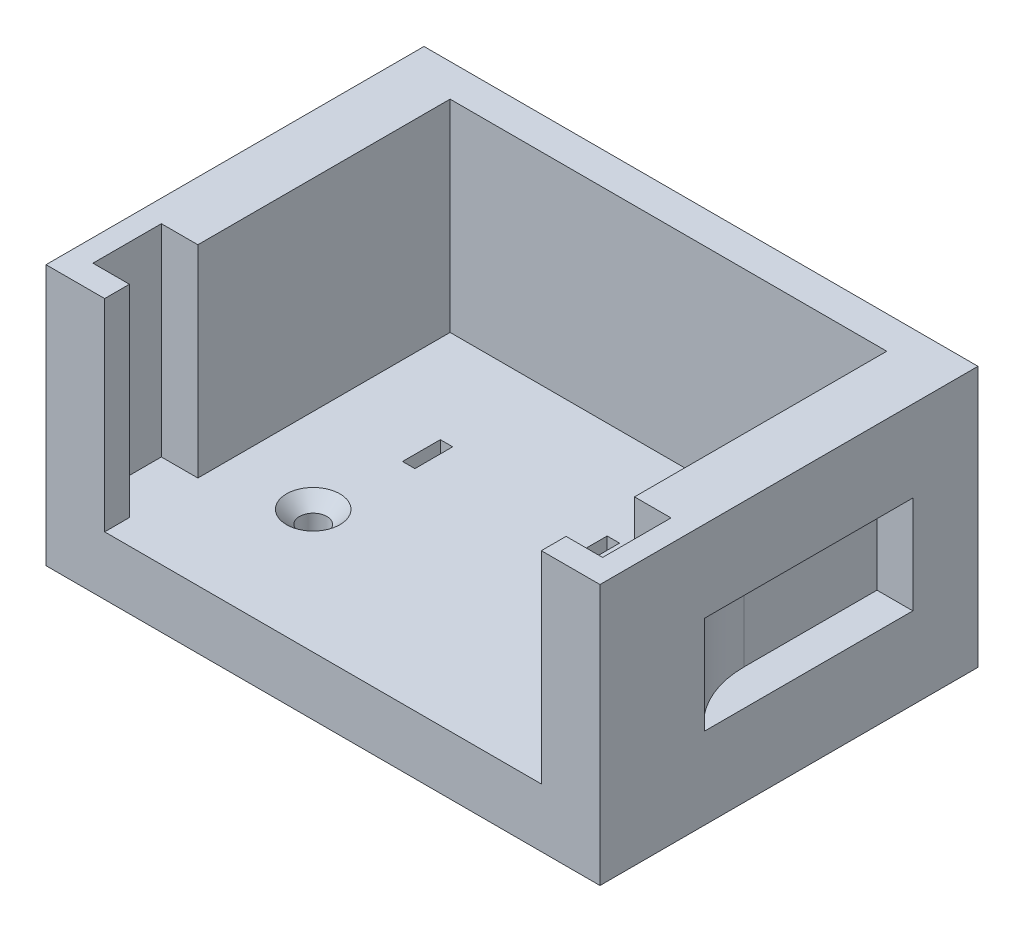
ISO-10303-21;
HEADER;
FILE_DESCRIPTION(('STEP AP214'),'2;1');
FILE_NAME('part.step','',(''),(''),'','','');
FILE_SCHEMA(('AUTOMOTIVE_DESIGN { 1 0 10303 214 1 1 1 1 }'));
ENDSEC;
DATA;
#1=APPLICATION_CONTEXT('core data for automotive mechanical design processes');
#2=APPLICATION_PROTOCOL_DEFINITION('international standard','automotive_design',2000,#1);
#3=PRODUCT_CONTEXT('',#1,'mechanical');
#4=PRODUCT('Part','Part','',(#3));
#5=PRODUCT_RELATED_PRODUCT_CATEGORY('part','',(#4));
#6=PRODUCT_DEFINITION_FORMATION('','',#4);
#7=PRODUCT_DEFINITION_CONTEXT('part definition',#1,'design');
#8=PRODUCT_DEFINITION('design','',#6,#7);
#9=PRODUCT_DEFINITION_SHAPE('','',#8);
#10=(LENGTH_UNIT() NAMED_UNIT(*) SI_UNIT(.MILLI.,.METRE.));
#11=(NAMED_UNIT(*) PLANE_ANGLE_UNIT() SI_UNIT($,.RADIAN.));
#12=(NAMED_UNIT(*) SI_UNIT($,.STERADIAN.) SOLID_ANGLE_UNIT());
#13=UNCERTAINTY_MEASURE_WITH_UNIT(LENGTH_MEASURE(1.E-05),#10,'distance_accuracy_value','');
#14=(GEOMETRIC_REPRESENTATION_CONTEXT(3) GLOBAL_UNCERTAINTY_ASSIGNED_CONTEXT((#13)) GLOBAL_UNIT_ASSIGNED_CONTEXT((#10,
#11,#12)) REPRESENTATION_CONTEXT('',''));
#15=CARTESIAN_POINT('',(0.,0.,0.));
#16=DIRECTION('',(0.,0.,1.));
#17=DIRECTION('',(1.,0.,0.));
#18=AXIS2_PLACEMENT_3D('',#15,#16,#17);
#19=CARTESIAN_POINT('',(42.5,-9.00000000000001,-33.));
#20=DIRECTION('',(1.,0.,0.));
#21=DIRECTION('',(0.,0.,-1.));
#22=AXIS2_PLACEMENT_3D('',#19,#20,#21);
#23=PLANE('',#22);
#24=DIRECTION('',(0.,1.,0.));
#25=VECTOR('',#24,1.);
#26=CARTESIAN_POINT('',(42.5,-13.,25.));
#27=LINE('',#26,#25);
#28=CARTESIAN_POINT('',(42.5,0.,25.));
#29=VERTEX_POINT('',#28);
#30=CARTESIAN_POINT('',(42.5,40.,25.));
#31=VERTEX_POINT('',#30);
#32=EDGE_CURVE('E242',#29,#31,#27,.T.);
#33=ORIENTED_EDGE('',*,*,#32,.F.);
#34=DIRECTION('',(0.,0.,-1.));
#35=VECTOR('',#34,1.);
#36=CARTESIAN_POINT('',(42.5,0.,0.));
#37=LINE('',#36,#35);
#38=CARTESIAN_POINT('',(42.5,0.,-33.));
#39=VERTEX_POINT('',#38);
#40=EDGE_CURVE('E342',#29,#39,#37,.T.);
#41=ORIENTED_EDGE('',*,*,#40,.T.);
#42=DIRECTION('',(0.,1.,0.));
#43=VECTOR('',#42,1.);
#44=CARTESIAN_POINT('',(42.5,-9.00000000000001,-33.));
#45=LINE('',#44,#43);
#46=CARTESIAN_POINT('',(42.5,40.,-33.));
#47=VERTEX_POINT('',#46);
#48=EDGE_CURVE('E267',#39,#47,#45,.T.);
#49=ORIENTED_EDGE('',*,*,#48,.T.);
#50=DIRECTION('',(0.,0.,-1.));
#51=VECTOR('',#50,1.);
#52=CARTESIAN_POINT('',(42.5,40.,0.));
#53=LINE('',#52,#51);
#54=EDGE_CURVE('E258',#31,#47,#53,.T.);
#55=ORIENTED_EDGE('',*,*,#54,.F.);
#56=EDGE_LOOP('',(#33,#41,#49,#55));
#57=FACE_BOUND('',#56,.T.);
#58=DIRECTION('',(0.,0.,-1.));
#59=VECTOR('',#58,1.);
#60=CARTESIAN_POINT('',(42.5,27.5,-23.));
#61=LINE('',#60,#59);
#62=CARTESIAN_POINT('',(42.5,27.5,8.99999999999998));
#63=VERTEX_POINT('',#62);
#64=CARTESIAN_POINT('',(42.5,27.5,-23.));
#65=VERTEX_POINT('',#64);
#66=EDGE_CURVE('E302',#63,#65,#61,.T.);
#67=ORIENTED_EDGE('',*,*,#66,.T.);
#68=DIRECTION('',(0.,-1.,0.));
#69=VECTOR('',#68,1.);
#70=CARTESIAN_POINT('',(42.5,27.5,-23.));
#71=LINE('',#70,#69);
#72=CARTESIAN_POINT('',(42.5,12.5,-23.));
#73=VERTEX_POINT('',#72);
#74=EDGE_CURVE('E298',#65,#73,#71,.T.);
#75=ORIENTED_EDGE('',*,*,#74,.T.);
#76=DIRECTION('',(0.,0.,1.));
#77=VECTOR('',#76,1.);
#78=CARTESIAN_POINT('',(42.5,12.5,-23.));
#79=LINE('',#78,#77);
#80=CARTESIAN_POINT('',(42.5,12.5,8.99999999999998));
#81=VERTEX_POINT('',#80);
#82=EDGE_CURVE('E289',#73,#81,#79,.T.);
#83=ORIENTED_EDGE('',*,*,#82,.T.);
#84=DIRECTION('',(0.,1.,0.));
#85=VECTOR('',#84,1.);
#86=CARTESIAN_POINT('',(42.5,27.5,8.99999999999998));
#87=LINE('',#86,#85);
#88=EDGE_CURVE('E297',#81,#63,#87,.T.);
#89=ORIENTED_EDGE('',*,*,#88,.T.);
#90=EDGE_LOOP('',(#67,#75,#83,#89));
#91=FACE_BOUND('',#90,.T.);
#92=ADVANCED_FACE('F35',(#57,#91),#23,.T.);
#93=CARTESIAN_POINT('',(0.,0.,0.));
#94=DIRECTION('',(0.,1.,0.));
#95=DIRECTION('',(0.,0.,1.));
#96=AXIS2_PLACEMENT_3D('',#93,#94,#95);
#97=PLANE('',#96);
#98=DIRECTION('',(-1.,0.,0.));
#99=VECTOR('',#98,1.);
#100=CARTESIAN_POINT('',(0.,0.,-13.));
#101=LINE('',#100,#99);
#102=CARTESIAN_POINT('',(7.50000000000001,0.,-13.));
#103=VERTEX_POINT('',#102);
#104=CARTESIAN_POINT('',(5.6,0.,-13.));
#105=VERTEX_POINT('',#104);
#106=EDGE_CURVE('E484',#103,#105,#101,.T.);
#107=ORIENTED_EDGE('',*,*,#106,.T.);
#108=DIRECTION('',(0.,0.,1.));
#109=VECTOR('',#108,1.);
#110=CARTESIAN_POINT('',(5.6,0.,0.));
#111=LINE('',#110,#109);
#112=CARTESIAN_POINT('',(5.6,0.,-7.20000000000001));
#113=VERTEX_POINT('',#112);
#114=EDGE_CURVE('E487',#105,#113,#111,.T.);
#115=ORIENTED_EDGE('',*,*,#114,.T.);
#116=DIRECTION('',(1.,0.,0.));
#117=VECTOR('',#116,1.);
#118=CARTESIAN_POINT('',(0.,0.,-7.20000000000001));
#119=LINE('',#118,#117);
#120=CARTESIAN_POINT('',(7.50000000000001,0.,-7.20000000000001));
#121=VERTEX_POINT('',#120);
#122=EDGE_CURVE('E478',#113,#121,#119,.T.);
#123=ORIENTED_EDGE('',*,*,#122,.T.);
#124=DIRECTION('',(0.,0.,-1.));
#125=VECTOR('',#124,1.);
#126=CARTESIAN_POINT('',(7.50000000000001,0.,0.));
#127=LINE('',#126,#125);
#128=EDGE_CURVE('E481',#121,#103,#127,.T.);
#129=ORIENTED_EDGE('',*,*,#128,.T.);
#130=EDGE_LOOP('',(#107,#115,#123,#129));
#131=FACE_BOUND('',#130,.T.);
#132=DIRECTION('',(-1.,0.,0.));
#133=VECTOR('',#132,1.);
#134=CARTESIAN_POINT('',(0.,0.,-13.));
#135=LINE('',#134,#133);
#136=CARTESIAN_POINT('',(-18.1,0.,-13.));
#137=VERTEX_POINT('',#136);
#138=CARTESIAN_POINT('',(-20.,0.,-13.));
#139=VERTEX_POINT('',#138);
#140=EDGE_CURVE('E275',#137,#139,#135,.T.);
#141=ORIENTED_EDGE('',*,*,#140,.T.);
#142=DIRECTION('',(0.,0.,1.));
#143=VECTOR('',#142,1.);
#144=CARTESIAN_POINT('',(-20.,0.,0.));
#145=LINE('',#144,#143);
#146=CARTESIAN_POINT('',(-20.,0.,-7.20000000000001));
#147=VERTEX_POINT('',#146);
#148=EDGE_CURVE('E269',#139,#147,#145,.T.);
#149=ORIENTED_EDGE('',*,*,#148,.T.);
#150=DIRECTION('',(1.,0.,0.));
#151=VECTOR('',#150,1.);
#152=CARTESIAN_POINT('',(0.,0.,-7.20000000000001));
#153=LINE('',#152,#151);
#154=CARTESIAN_POINT('',(-18.1,0.,-7.20000000000001));
#155=VERTEX_POINT('',#154);
#156=EDGE_CURVE('E490',#147,#155,#153,.T.);
#157=ORIENTED_EDGE('',*,*,#156,.T.);
#158=DIRECTION('',(0.,0.,-1.));
#159=VECTOR('',#158,1.);
#160=CARTESIAN_POINT('',(-18.1,0.,0.));
#161=LINE('',#160,#159);
#162=EDGE_CURVE('E493',#155,#137,#161,.T.);
#163=ORIENTED_EDGE('',*,*,#162,.T.);
#164=EDGE_LOOP('',(#141,#149,#157,#163));
#165=FACE_BOUND('',#164,.T.);
#166=CARTESIAN_POINT('',(20.5,0.,5.99999999999999));
#167=DIRECTION('',(0.,1.,0.));
#168=DIRECTION('',(0.,0.,1.));
#169=AXIS2_PLACEMENT_3D('',#166,#167,#168);
#170=CIRCLE('',#169,2.1);
#171=CARTESIAN_POINT('',(20.5,0.,8.09999999999999));
#172=VERTEX_POINT('',#171);
#173=EDGE_CURVE('E365',#172,#172,#170,.T.);
#174=ORIENTED_EDGE('',*,*,#173,.T.);
#175=EDGE_LOOP('',(#174));
#176=FACE_BOUND('',#175,.T.);
#177=CARTESIAN_POINT('',(-20.5,0.,5.99999999999999));
#178=DIRECTION('',(0.,1.,0.));
#179=DIRECTION('',(0.,0.,1.));
#180=AXIS2_PLACEMENT_3D('',#177,#178,#179);
#181=CIRCLE('',#180,2.1);
#182=CARTESIAN_POINT('',(-20.5,0.,8.09999999999999));
#183=VERTEX_POINT('',#182);
#184=EDGE_CURVE('E356',#183,#183,#181,.T.);
#185=ORIENTED_EDGE('',*,*,#184,.T.);
#186=EDGE_LOOP('',(#185));
#187=FACE_BOUND('',#186,.T.);
#188=ORIENTED_EDGE('',*,*,#40,.F.);
#189=DIRECTION('',(-1.,0.,0.));
#190=VECTOR('',#189,1.);
#191=CARTESIAN_POINT('',(0.,0.,25.));
#192=LINE('',#191,#190);
#193=CARTESIAN_POINT('',(-42.5,0.,25.));
#194=VERTEX_POINT('',#193);
#195=EDGE_CURVE('E248',#29,#194,#192,.T.);
#196=ORIENTED_EDGE('',*,*,#195,.T.);
#197=DIRECTION('',(0.,0.,1.));
#198=VECTOR('',#197,1.);
#199=CARTESIAN_POINT('',(-42.5,0.,0.));
#200=LINE('',#199,#198);
#201=CARTESIAN_POINT('',(-42.5,0.,-33.));
#202=VERTEX_POINT('',#201);
#203=EDGE_CURVE('E347',#202,#194,#200,.T.);
#204=ORIENTED_EDGE('',*,*,#203,.F.);
#205=DIRECTION('',(-1.,0.,0.));
#206=VECTOR('',#205,1.);
#207=CARTESIAN_POINT('',(0.,0.,-33.));
#208=LINE('',#207,#206);
#209=EDGE_CURVE('E345',#39,#202,#208,.T.);
#210=ORIENTED_EDGE('',*,*,#209,.F.);
#211=EDGE_LOOP('',(#188,#196,#204,#210));
#212=FACE_BOUND('',#211,.T.);
#213=ADVANCED_FACE('F497',(#131,#165,#176,#187,#212),#97,.F.);
#214=CARTESIAN_POINT('',(0.,40.,0.));
#215=DIRECTION('',(0.,1.,0.));
#216=DIRECTION('',(0.,0.,1.));
#217=AXIS2_PLACEMENT_3D('',#214,#215,#216);
#218=PLANE('',#217);
#219=DIRECTION('',(-1.,0.,0.));
#220=VECTOR('',#219,1.);
#221=CARTESIAN_POINT('',(-42.5,40.,25.));
#222=LINE('',#221,#220);
#223=CARTESIAN_POINT('',(33.5,40.,25.));
#224=VERTEX_POINT('',#223);
#225=EDGE_CURVE('E245',#31,#224,#222,.T.);
#226=ORIENTED_EDGE('',*,*,#225,.F.);
#227=ORIENTED_EDGE('',*,*,#54,.T.);
#228=DIRECTION('',(-1.,0.,0.));
#229=VECTOR('',#228,1.);
#230=CARTESIAN_POINT('',(-42.5,40.,-33.));
#231=LINE('',#230,#229);
#232=CARTESIAN_POINT('',(-42.5,40.,-33.));
#233=VERTEX_POINT('',#232);
#234=EDGE_CURVE('E338',#47,#233,#231,.T.);
#235=ORIENTED_EDGE('',*,*,#234,.T.);
#236=DIRECTION('',(0.,0.,1.));
#237=VECTOR('',#236,1.);
#238=CARTESIAN_POINT('',(-42.5,40.,-33.));
#239=LINE('',#238,#237);
#240=CARTESIAN_POINT('',(-42.5,40.,25.));
#241=VERTEX_POINT('',#240);
#242=EDGE_CURVE('E333',#233,#241,#239,.T.);
#243=ORIENTED_EDGE('',*,*,#242,.T.);
#244=CARTESIAN_POINT('',(-33.5,40.,25.));
#245=VERTEX_POINT('',#244);
#246=EDGE_CURVE('E49',#245,#241,#222,.T.);
#247=ORIENTED_EDGE('',*,*,#246,.F.);
#248=DIRECTION('',(0.,0.,-1.));
#249=VECTOR('',#248,1.);
#250=CARTESIAN_POINT('',(-33.5,40.,35.));
#251=LINE('',#250,#249);
#252=CARTESIAN_POINT('',(-33.5,40.,21.2));
#253=VERTEX_POINT('',#252);
#254=EDGE_CURVE('E456',#245,#253,#251,.T.);
#255=ORIENTED_EDGE('',*,*,#254,.T.);
#256=DIRECTION('',(1.,0.,0.));
#257=VECTOR('',#256,1.);
#258=CARTESIAN_POINT('',(-33.5,40.,21.2));
#259=LINE('',#258,#257);
#260=CARTESIAN_POINT('',(-39.1,40.,21.2));
#261=VERTEX_POINT('',#260);
#262=EDGE_CURVE('E422',#261,#253,#259,.T.);
#263=ORIENTED_EDGE('',*,*,#262,.F.);
#264=DIRECTION('',(0.,0.,1.));
#265=VECTOR('',#264,1.);
#266=CARTESIAN_POINT('',(-39.1,40.,10.7));
#267=LINE('',#266,#265);
#268=CARTESIAN_POINT('',(-39.1,40.,10.7));
#269=VERTEX_POINT('',#268);
#270=EDGE_CURVE('E418',#269,#261,#267,.T.);
#271=ORIENTED_EDGE('',*,*,#270,.F.);
#272=DIRECTION('',(-1.,0.,0.));
#273=VECTOR('',#272,1.);
#274=CARTESIAN_POINT('',(-33.5,40.,10.7));
#275=LINE('',#274,#273);
#276=CARTESIAN_POINT('',(-33.5,40.,10.7));
#277=VERTEX_POINT('',#276);
#278=EDGE_CURVE('E415',#277,#269,#275,.T.);
#279=ORIENTED_EDGE('',*,*,#278,.F.);
#280=CARTESIAN_POINT('',(-33.5,40.,-28.));
#281=VERTEX_POINT('',#280);
#282=EDGE_CURVE('E459',#277,#281,#251,.T.);
#283=ORIENTED_EDGE('',*,*,#282,.T.);
#284=DIRECTION('',(1.,0.,0.));
#285=VECTOR('',#284,1.);
#286=CARTESIAN_POINT('',(-33.5,40.,-28.));
#287=LINE('',#286,#285);
#288=CARTESIAN_POINT('',(33.5,40.,-28.));
#289=VERTEX_POINT('',#288);
#290=EDGE_CURVE('E458',#281,#289,#287,.T.);
#291=ORIENTED_EDGE('',*,*,#290,.T.);
#292=DIRECTION('',(0.,0.,1.));
#293=VECTOR('',#292,1.);
#294=CARTESIAN_POINT('',(33.5,40.,-28.));
#295=LINE('',#294,#293);
#296=CARTESIAN_POINT('',(33.5,40.,10.7));
#297=VERTEX_POINT('',#296);
#298=EDGE_CURVE('E461',#289,#297,#295,.T.);
#299=ORIENTED_EDGE('',*,*,#298,.T.);
#300=DIRECTION('',(-1.,0.,0.));
#301=VECTOR('',#300,1.);
#302=CARTESIAN_POINT('',(33.5,40.,10.7));
#303=LINE('',#302,#301);
#304=CARTESIAN_POINT('',(39.1,40.,10.7));
#305=VERTEX_POINT('',#304);
#306=EDGE_CURVE('E445',#305,#297,#303,.T.);
#307=ORIENTED_EDGE('',*,*,#306,.F.);
#308=DIRECTION('',(0.,0.,-1.));
#309=VECTOR('',#308,1.);
#310=CARTESIAN_POINT('',(39.1,40.,10.7));
#311=LINE('',#310,#309);
#312=CARTESIAN_POINT('',(39.1,40.,21.2));
#313=VERTEX_POINT('',#312);
#314=EDGE_CURVE('E442',#313,#305,#311,.T.);
#315=ORIENTED_EDGE('',*,*,#314,.F.);
#316=DIRECTION('',(1.,0.,0.));
#317=VECTOR('',#316,1.);
#318=CARTESIAN_POINT('',(33.5,40.,21.2));
#319=LINE('',#318,#317);
#320=CARTESIAN_POINT('',(33.5,40.,21.2));
#321=VERTEX_POINT('',#320);
#322=EDGE_CURVE('E384',#321,#313,#319,.T.);
#323=ORIENTED_EDGE('',*,*,#322,.F.);
#324=EDGE_CURVE('E262',#321,#224,#295,.T.);
#325=ORIENTED_EDGE('',*,*,#324,.T.);
#326=EDGE_LOOP('',(#226,#227,#235,#243,#247,#255,#263,#271,#279,#283,#291,#299,#307,#315,#323,#325));
#327=FACE_BOUND('',#326,.T.);
#328=ADVANCED_FACE('F256',(#327),#218,.T.);
#329=CARTESIAN_POINT('',(0.,9.,0.));
#330=DIRECTION('',(0.,1.,0.));
#331=DIRECTION('',(0.,0.,1.));
#332=AXIS2_PLACEMENT_3D('',#329,#330,#331);
#333=PLANE('',#332);
#334=DIRECTION('',(0.,0.,1.));
#335=VECTOR('',#334,1.);
#336=CARTESIAN_POINT('',(33.5,9.,-28.));
#337=LINE('',#336,#335);
#338=CARTESIAN_POINT('',(33.5,9.,-28.));
#339=VERTEX_POINT('',#338);
#340=CARTESIAN_POINT('',(33.5,9.,10.7));
#341=VERTEX_POINT('',#340);
#342=EDGE_CURVE('E470',#339,#341,#337,.T.);
#343=ORIENTED_EDGE('',*,*,#342,.F.);
#344=DIRECTION('',(1.,0.,0.));
#345=VECTOR('',#344,1.);
#346=CARTESIAN_POINT('',(-33.5,9.,-28.));
#347=LINE('',#346,#345);
#348=CARTESIAN_POINT('',(-33.5,9.,-28.));
#349=VERTEX_POINT('',#348);
#350=EDGE_CURVE('E467',#349,#339,#347,.T.);
#351=ORIENTED_EDGE('',*,*,#350,.F.);
#352=DIRECTION('',(0.,0.,-1.));
#353=VECTOR('',#352,1.);
#354=CARTESIAN_POINT('',(-33.5,9.,35.));
#355=LINE('',#354,#353);
#356=CARTESIAN_POINT('',(-33.5,9.,10.7));
#357=VERTEX_POINT('',#356);
#358=EDGE_CURVE('E434',#357,#349,#355,.T.);
#359=ORIENTED_EDGE('',*,*,#358,.F.);
#360=DIRECTION('',(1.,0.,0.));
#361=VECTOR('',#360,1.);
#362=CARTESIAN_POINT('',(-33.5,9.,10.7));
#363=LINE('',#362,#361);
#364=CARTESIAN_POINT('',(-39.1,9.,10.7));
#365=VERTEX_POINT('',#364);
#366=EDGE_CURVE('E414',#365,#357,#363,.T.);
#367=ORIENTED_EDGE('',*,*,#366,.F.);
#368=DIRECTION('',(0.,0.,-1.));
#369=VECTOR('',#368,1.);
#370=CARTESIAN_POINT('',(-39.1,9.,10.7));
#371=LINE('',#370,#369);
#372=CARTESIAN_POINT('',(-39.1,9.,21.2));
#373=VERTEX_POINT('',#372);
#374=EDGE_CURVE('E409',#373,#365,#371,.T.);
#375=ORIENTED_EDGE('',*,*,#374,.F.);
#376=DIRECTION('',(-1.,0.,0.));
#377=VECTOR('',#376,1.);
#378=CARTESIAN_POINT('',(-33.5,9.,21.2));
#379=LINE('',#378,#377);
#380=CARTESIAN_POINT('',(-33.5,9.,21.2));
#381=VERTEX_POINT('',#380);
#382=EDGE_CURVE('E411',#381,#373,#379,.T.);
#383=ORIENTED_EDGE('',*,*,#382,.F.);
#384=CARTESIAN_POINT('',(-33.5,9.,25.));
#385=VERTEX_POINT('',#384);
#386=EDGE_CURVE('E465',#385,#381,#355,.T.);
#387=ORIENTED_EDGE('',*,*,#386,.F.);
#388=DIRECTION('',(-1.,0.,0.));
#389=VECTOR('',#388,1.);
#390=CARTESIAN_POINT('',(0.,9.,25.));
#391=LINE('',#390,#389);
#392=CARTESIAN_POINT('',(33.5,9.,25.));
#393=VERTEX_POINT('',#392);
#394=EDGE_CURVE('E944',#393,#385,#391,.T.);
#395=ORIENTED_EDGE('',*,*,#394,.F.);
#396=CARTESIAN_POINT('',(33.5,9.,21.2));
#397=VERTEX_POINT('',#396);
#398=EDGE_CURVE('E469',#397,#393,#337,.T.);
#399=ORIENTED_EDGE('',*,*,#398,.F.);
#400=DIRECTION('',(-1.,0.,0.));
#401=VECTOR('',#400,1.);
#402=CARTESIAN_POINT('',(33.5,9.,21.2));
#403=LINE('',#402,#401);
#404=CARTESIAN_POINT('',(39.1,9.,21.2));
#405=VERTEX_POINT('',#404);
#406=EDGE_CURVE('E419',#405,#397,#403,.T.);
#407=ORIENTED_EDGE('',*,*,#406,.F.);
#408=DIRECTION('',(0.,0.,1.));
#409=VECTOR('',#408,1.);
#410=CARTESIAN_POINT('',(39.1,9.,10.7));
#411=LINE('',#410,#409);
#412=CARTESIAN_POINT('',(39.1,9.,10.7));
#413=VERTEX_POINT('',#412);
#414=EDGE_CURVE('E435',#413,#405,#411,.T.);
#415=ORIENTED_EDGE('',*,*,#414,.F.);
#416=DIRECTION('',(1.,0.,0.));
#417=VECTOR('',#416,1.);
#418=CARTESIAN_POINT('',(33.5,9.,10.7));
#419=LINE('',#418,#417);
#420=EDGE_CURVE('E437',#341,#413,#419,.T.);
#421=ORIENTED_EDGE('',*,*,#420,.F.);
#422=EDGE_LOOP('',(#343,#351,#359,#367,#375,#383,#387,#395,#399,#407,#415,#421));
#423=FACE_BOUND('',#422,.T.);
#424=CARTESIAN_POINT('',(-20.5,9.,5.99999999999999));
#425=DIRECTION('',(0.,1.,0.));
#426=DIRECTION('',(0.,0.,1.));
#427=AXIS2_PLACEMENT_3D('',#424,#425,#426);
#428=CIRCLE('',#427,4.1);
#429=CARTESIAN_POINT('',(-20.5,9.,10.1));
#430=VERTEX_POINT('',#429);
#431=EDGE_CURVE('E350',#430,#430,#428,.T.);
#432=ORIENTED_EDGE('',*,*,#431,.F.);
#433=EDGE_LOOP('',(#432));
#434=FACE_BOUND('',#433,.T.);
#435=CARTESIAN_POINT('',(20.5,9.,5.99999999999999));
#436=DIRECTION('',(0.,1.,0.));
#437=DIRECTION('',(0.,0.,1.));
#438=AXIS2_PLACEMENT_3D('',#435,#436,#437);
#439=CIRCLE('',#438,4.1);
#440=CARTESIAN_POINT('',(20.5,9.,10.1));
#441=VERTEX_POINT('',#440);
#442=EDGE_CURVE('E359',#441,#441,#439,.T.);
#443=ORIENTED_EDGE('',*,*,#442,.F.);
#444=EDGE_LOOP('',(#443));
#445=FACE_BOUND('',#444,.T.);
#446=DIRECTION('',(0.,0.,1.));
#447=VECTOR('',#446,1.);
#448=CARTESIAN_POINT('',(-20.,9.,-13.));
#449=LINE('',#448,#447);
#450=CARTESIAN_POINT('',(-20.,9.,-13.));
#451=VERTEX_POINT('',#450);
#452=CARTESIAN_POINT('',(-20.,9.,-7.20000000000001));
#453=VERTEX_POINT('',#452);
#454=EDGE_CURVE('E369',#451,#453,#449,.T.);
#455=ORIENTED_EDGE('',*,*,#454,.F.);
#456=DIRECTION('',(-1.,0.,0.));
#457=VECTOR('',#456,1.);
#458=CARTESIAN_POINT('',(-20.,9.,-13.));
#459=LINE('',#458,#457);
#460=CARTESIAN_POINT('',(-18.1,9.,-13.));
#461=VERTEX_POINT('',#460);
#462=EDGE_CURVE('E378',#461,#451,#459,.T.);
#463=ORIENTED_EDGE('',*,*,#462,.F.);
#464=DIRECTION('',(0.,0.,-1.));
#465=VECTOR('',#464,1.);
#466=CARTESIAN_POINT('',(-18.1,9.,-13.));
#467=LINE('',#466,#465);
#468=CARTESIAN_POINT('',(-18.1,9.,-7.20000000000001));
#469=VERTEX_POINT('',#468);
#470=EDGE_CURVE('E375',#469,#461,#467,.T.);
#471=ORIENTED_EDGE('',*,*,#470,.F.);
#472=DIRECTION('',(1.,0.,0.));
#473=VECTOR('',#472,1.);
#474=CARTESIAN_POINT('',(-20.,9.,-7.20000000000001));
#475=LINE('',#474,#473);
#476=EDGE_CURVE('E371',#453,#469,#475,.T.);
#477=ORIENTED_EDGE('',*,*,#476,.F.);
#478=EDGE_LOOP('',(#455,#463,#471,#477));
#479=FACE_BOUND('',#478,.T.);
#480=DIRECTION('',(0.,0.,1.));
#481=VECTOR('',#480,1.);
#482=CARTESIAN_POINT('',(5.6,9.,-13.));
#483=LINE('',#482,#481);
#484=CARTESIAN_POINT('',(5.6,9.,-13.));
#485=VERTEX_POINT('',#484);
#486=CARTESIAN_POINT('',(5.6,9.,-7.20000000000001));
#487=VERTEX_POINT('',#486);
#488=EDGE_CURVE('E368',#485,#487,#483,.T.);
#489=ORIENTED_EDGE('',*,*,#488,.F.);
#490=DIRECTION('',(-1.,0.,0.));
#491=VECTOR('',#490,1.);
#492=CARTESIAN_POINT('',(5.6,9.,-13.));
#493=LINE('',#492,#491);
#494=CARTESIAN_POINT('',(7.50000000000001,9.,-13.));
#495=VERTEX_POINT('',#494);
#496=EDGE_CURVE('E398',#495,#485,#493,.T.);
#497=ORIENTED_EDGE('',*,*,#496,.F.);
#498=DIRECTION('',(0.,0.,-1.));
#499=VECTOR('',#498,1.);
#500=CARTESIAN_POINT('',(7.50000000000001,9.,-13.));
#501=LINE('',#500,#499);
#502=CARTESIAN_POINT('',(7.50000000000001,9.,-7.20000000000001));
#503=VERTEX_POINT('',#502);
#504=EDGE_CURVE('E395',#503,#495,#501,.T.);
#505=ORIENTED_EDGE('',*,*,#504,.F.);
#506=DIRECTION('',(1.,0.,0.));
#507=VECTOR('',#506,1.);
#508=CARTESIAN_POINT('',(5.6,9.,-7.20000000000001));
#509=LINE('',#508,#507);
#510=EDGE_CURVE('E392',#487,#503,#509,.T.);
#511=ORIENTED_EDGE('',*,*,#510,.F.);
#512=EDGE_LOOP('',(#489,#497,#505,#511));
#513=FACE_BOUND('',#512,.T.);
#514=ADVANCED_FACE('F511',(#423,#434,#445,#479,#513),#333,.T.);
#515=CARTESIAN_POINT('',(-33.5,40.,-28.));
#516=DIRECTION('',(0.,0.,-1.));
#517=DIRECTION('',(-1.,0.,0.));
#518=AXIS2_PLACEMENT_3D('',#515,#516,#517);
#519=PLANE('',#518);
#520=ORIENTED_EDGE('',*,*,#350,.T.);
#521=DIRECTION('',(0.,-1.,0.));
#522=VECTOR('',#521,1.);
#523=CARTESIAN_POINT('',(33.5,40.,-28.));
#524=LINE('',#523,#522);
#525=EDGE_CURVE('E464',#289,#339,#524,.T.);
#526=ORIENTED_EDGE('',*,*,#525,.F.);
#527=ORIENTED_EDGE('',*,*,#290,.F.);
#528=DIRECTION('',(0.,-1.,0.));
#529=VECTOR('',#528,1.);
#530=CARTESIAN_POINT('',(-33.5,40.,-28.));
#531=LINE('',#530,#529);
#532=EDGE_CURVE('E475',#281,#349,#531,.T.);
#533=ORIENTED_EDGE('',*,*,#532,.T.);
#534=EDGE_LOOP('',(#520,#526,#527,#533));
#535=FACE_BOUND('',#534,.T.);
#536=ADVANCED_FACE('F611',(#535),#519,.F.);
#537=CARTESIAN_POINT('',(-33.5,40.,35.));
#538=DIRECTION('',(-1.,0.,0.));
#539=DIRECTION('',(0.,0.,1.));
#540=AXIS2_PLACEMENT_3D('',#537,#538,#539);
#541=PLANE('',#540);
#542=ORIENTED_EDGE('',*,*,#254,.F.);
#543=DIRECTION('',(0.,-1.,0.));
#544=VECTOR('',#543,1.);
#545=CARTESIAN_POINT('',(-33.5,40.,25.));
#546=LINE('',#545,#544);
#547=EDGE_CURVE('E915',#245,#385,#546,.T.);
#548=ORIENTED_EDGE('',*,*,#547,.T.);
#549=ORIENTED_EDGE('',*,*,#386,.T.);
#550=DIRECTION('',(0.,1.,0.));
#551=VECTOR('',#550,1.);
#552=CARTESIAN_POINT('',(-33.5,-2.90000000000001,21.2));
#553=LINE('',#552,#551);
#554=EDGE_CURVE('E412',#381,#253,#553,.T.);
#555=ORIENTED_EDGE('',*,*,#554,.T.);
#556=EDGE_LOOP('',(#542,#548,#549,#555));
#557=FACE_BOUND('',#556,.T.);
#558=ADVANCED_FACE('F614',(#557),#541,.F.);
#559=CARTESIAN_POINT('',(33.5,40.,-28.));
#560=DIRECTION('',(1.,0.,0.));
#561=DIRECTION('',(0.,0.,-1.));
#562=AXIS2_PLACEMENT_3D('',#559,#560,#561);
#563=PLANE('',#562);
#564=ORIENTED_EDGE('',*,*,#342,.T.);
#565=DIRECTION('',(0.,1.,0.));
#566=VECTOR('',#565,1.);
#567=CARTESIAN_POINT('',(33.5,-2.90000000000001,10.7));
#568=LINE('',#567,#566);
#569=EDGE_CURVE('E438',#341,#297,#568,.T.);
#570=ORIENTED_EDGE('',*,*,#569,.T.);
#571=ORIENTED_EDGE('',*,*,#298,.F.);
#572=ORIENTED_EDGE('',*,*,#525,.T.);
#573=EDGE_LOOP('',(#564,#570,#571,#572));
#574=FACE_BOUND('',#573,.T.);
#575=ADVANCED_FACE('F610',(#574),#563,.F.);
#576=ORIENTED_EDGE('',*,*,#282,.F.);
#577=DIRECTION('',(0.,1.,0.));
#578=VECTOR('',#577,1.);
#579=CARTESIAN_POINT('',(-33.5,-2.90000000000001,10.7));
#580=LINE('',#579,#578);
#581=EDGE_CURVE('E425',#357,#277,#580,.T.);
#582=ORIENTED_EDGE('',*,*,#581,.F.);
#583=ORIENTED_EDGE('',*,*,#358,.T.);
#584=ORIENTED_EDGE('',*,*,#532,.F.);
#585=EDGE_LOOP('',(#576,#582,#583,#584));
#586=FACE_BOUND('',#585,.T.);
#587=ADVANCED_FACE('F608',(#586),#541,.F.);
#588=ORIENTED_EDGE('',*,*,#398,.T.);
#589=DIRECTION('',(0.,1.,0.));
#590=VECTOR('',#589,1.);
#591=CARTESIAN_POINT('',(33.5,40.,25.));
#592=LINE('',#591,#590);
#593=EDGE_CURVE('E252',#393,#224,#592,.T.);
#594=ORIENTED_EDGE('',*,*,#593,.T.);
#595=ORIENTED_EDGE('',*,*,#324,.F.);
#596=DIRECTION('',(0.,1.,0.));
#597=VECTOR('',#596,1.);
#598=CARTESIAN_POINT('',(33.5,-2.90000000000001,21.2));
#599=LINE('',#598,#597);
#600=EDGE_CURVE('E447',#397,#321,#599,.T.);
#601=ORIENTED_EDGE('',*,*,#600,.F.);
#602=EDGE_LOOP('',(#588,#594,#595,#601));
#603=FACE_BOUND('',#602,.T.);
#604=ADVANCED_FACE('F596',(#603),#563,.F.);
#605=CARTESIAN_POINT('',(33.5,-2.90000000000001,10.7));
#606=DIRECTION('',(0.,0.,-1.));
#607=DIRECTION('',(-1.,0.,0.));
#608=AXIS2_PLACEMENT_3D('',#605,#606,#607);
#609=PLANE('',#608);
#610=ORIENTED_EDGE('',*,*,#420,.T.);
#611=DIRECTION('',(0.,1.,0.));
#612=VECTOR('',#611,1.);
#613=CARTESIAN_POINT('',(39.1,-2.90000000000001,10.7));
#614=LINE('',#613,#612);
#615=EDGE_CURVE('E450',#413,#305,#614,.T.);
#616=ORIENTED_EDGE('',*,*,#615,.T.);
#617=ORIENTED_EDGE('',*,*,#306,.T.);
#618=ORIENTED_EDGE('',*,*,#569,.F.);
#619=EDGE_LOOP('',(#610,#616,#617,#618));
#620=FACE_BOUND('',#619,.T.);
#621=ADVANCED_FACE('F592',(#620),#609,.F.);
#622=CARTESIAN_POINT('',(39.1,-2.90000000000001,10.7));
#623=DIRECTION('',(1.,0.,0.));
#624=DIRECTION('',(0.,0.,-1.));
#625=AXIS2_PLACEMENT_3D('',#622,#623,#624);
#626=PLANE('',#625);
#627=ORIENTED_EDGE('',*,*,#414,.T.);
#628=DIRECTION('',(0.,1.,0.));
#629=VECTOR('',#628,1.);
#630=CARTESIAN_POINT('',(39.1,-2.90000000000001,21.2));
#631=LINE('',#630,#629);
#632=EDGE_CURVE('E452',#405,#313,#631,.T.);
#633=ORIENTED_EDGE('',*,*,#632,.T.);
#634=ORIENTED_EDGE('',*,*,#314,.T.);
#635=ORIENTED_EDGE('',*,*,#615,.F.);
#636=EDGE_LOOP('',(#627,#633,#634,#635));
#637=FACE_BOUND('',#636,.T.);
#638=ADVANCED_FACE('F595',(#637),#626,.F.);
#639=CARTESIAN_POINT('',(33.5,-2.90000000000001,21.2));
#640=DIRECTION('',(0.,0.,1.));
#641=DIRECTION('',(1.,0.,0.));
#642=AXIS2_PLACEMENT_3D('',#639,#640,#641);
#643=PLANE('',#642);
#644=ORIENTED_EDGE('',*,*,#406,.T.);
#645=ORIENTED_EDGE('',*,*,#600,.T.);
#646=ORIENTED_EDGE('',*,*,#322,.T.);
#647=ORIENTED_EDGE('',*,*,#632,.F.);
#648=EDGE_LOOP('',(#644,#645,#646,#647));
#649=FACE_BOUND('',#648,.T.);
#650=ADVANCED_FACE('F584',(#649),#643,.F.);
#651=CARTESIAN_POINT('',(-33.5,-2.90000000000001,21.2));
#652=DIRECTION('',(0.,0.,1.));
#653=DIRECTION('',(1.,0.,0.));
#654=AXIS2_PLACEMENT_3D('',#651,#652,#653);
#655=PLANE('',#654);
#656=ORIENTED_EDGE('',*,*,#382,.T.);
#657=DIRECTION('',(0.,1.,0.));
#658=VECTOR('',#657,1.);
#659=CARTESIAN_POINT('',(-39.1,-2.90000000000001,21.2));
#660=LINE('',#659,#658);
#661=EDGE_CURVE('E428',#373,#261,#660,.T.);
#662=ORIENTED_EDGE('',*,*,#661,.T.);
#663=ORIENTED_EDGE('',*,*,#262,.T.);
#664=ORIENTED_EDGE('',*,*,#554,.F.);
#665=EDGE_LOOP('',(#656,#662,#663,#664));
#666=FACE_BOUND('',#665,.T.);
#667=ADVANCED_FACE('F580',(#666),#655,.F.);
#668=CARTESIAN_POINT('',(-39.1,-2.90000000000001,10.7));
#669=DIRECTION('',(-1.,0.,0.));
#670=DIRECTION('',(0.,0.,1.));
#671=AXIS2_PLACEMENT_3D('',#668,#669,#670);
#672=PLANE('',#671);
#673=ORIENTED_EDGE('',*,*,#374,.T.);
#674=DIRECTION('',(0.,1.,0.));
#675=VECTOR('',#674,1.);
#676=CARTESIAN_POINT('',(-39.1,-2.90000000000001,10.7));
#677=LINE('',#676,#675);
#678=EDGE_CURVE('E430',#365,#269,#677,.T.);
#679=ORIENTED_EDGE('',*,*,#678,.T.);
#680=ORIENTED_EDGE('',*,*,#270,.T.);
#681=ORIENTED_EDGE('',*,*,#661,.F.);
#682=EDGE_LOOP('',(#673,#679,#680,#681));
#683=FACE_BOUND('',#682,.T.);
#684=ADVANCED_FACE('F583',(#683),#672,.F.);
#685=CARTESIAN_POINT('',(-33.5,-2.90000000000001,10.7));
#686=DIRECTION('',(0.,0.,-1.));
#687=DIRECTION('',(-1.,0.,0.));
#688=AXIS2_PLACEMENT_3D('',#685,#686,#687);
#689=PLANE('',#688);
#690=ORIENTED_EDGE('',*,*,#366,.T.);
#691=ORIENTED_EDGE('',*,*,#581,.T.);
#692=ORIENTED_EDGE('',*,*,#278,.T.);
#693=ORIENTED_EDGE('',*,*,#678,.F.);
#694=EDGE_LOOP('',(#690,#691,#692,#693));
#695=FACE_BOUND('',#694,.T.);
#696=ADVANCED_FACE('F578',(#695),#689,.F.);
#697=CARTESIAN_POINT('',(5.6,-10.,-13.));
#698=DIRECTION('',(-1.,0.,0.));
#699=DIRECTION('',(0.,0.,1.));
#700=AXIS2_PLACEMENT_3D('',#697,#698,#699);
#701=PLANE('',#700);
#702=DIRECTION('',(0.,1.,0.));
#703=VECTOR('',#702,1.);
#704=CARTESIAN_POINT('',(5.6,-10.,-13.));
#705=LINE('',#704,#703);
#706=EDGE_CURVE('E372',#105,#485,#705,.T.);
#707=ORIENTED_EDGE('',*,*,#706,.T.);
#708=ORIENTED_EDGE('',*,*,#488,.T.);
#709=DIRECTION('',(0.,1.,0.));
#710=VECTOR('',#709,1.);
#711=CARTESIAN_POINT('',(5.6,-10.,-7.20000000000001));
#712=LINE('',#711,#710);
#713=EDGE_CURVE('E401',#113,#487,#712,.T.);
#714=ORIENTED_EDGE('',*,*,#713,.F.);
#715=ORIENTED_EDGE('',*,*,#114,.F.);
#716=EDGE_LOOP('',(#707,#708,#714,#715));
#717=FACE_BOUND('',#716,.T.);
#718=ADVANCED_FACE('F571',(#717),#701,.F.);
#719=CARTESIAN_POINT('',(5.6,-10.,-13.));
#720=DIRECTION('',(0.,0.,-1.));
#721=DIRECTION('',(-1.,0.,0.));
#722=AXIS2_PLACEMENT_3D('',#719,#720,#721);
#723=PLANE('',#722);
#724=DIRECTION('',(0.,1.,0.));
#725=VECTOR('',#724,1.);
#726=CARTESIAN_POINT('',(7.50000000000001,-10.,-13.));
#727=LINE('',#726,#725);
#728=EDGE_CURVE('E403',#103,#495,#727,.T.);
#729=ORIENTED_EDGE('',*,*,#728,.T.);
#730=ORIENTED_EDGE('',*,*,#496,.T.);
#731=ORIENTED_EDGE('',*,*,#706,.F.);
#732=ORIENTED_EDGE('',*,*,#106,.F.);
#733=EDGE_LOOP('',(#729,#730,#731,#732));
#734=FACE_BOUND('',#733,.T.);
#735=ADVANCED_FACE('F568',(#734),#723,.F.);
#736=CARTESIAN_POINT('',(7.50000000000001,-10.,-13.));
#737=DIRECTION('',(1.,0.,0.));
#738=DIRECTION('',(0.,0.,-1.));
#739=AXIS2_PLACEMENT_3D('',#736,#737,#738);
#740=PLANE('',#739);
#741=DIRECTION('',(0.,1.,0.));
#742=VECTOR('',#741,1.);
#743=CARTESIAN_POINT('',(7.50000000000001,-10.,-7.20000000000001));
#744=LINE('',#743,#742);
#745=EDGE_CURVE('E405',#121,#503,#744,.T.);
#746=ORIENTED_EDGE('',*,*,#745,.T.);
#747=ORIENTED_EDGE('',*,*,#504,.T.);
#748=ORIENTED_EDGE('',*,*,#728,.F.);
#749=ORIENTED_EDGE('',*,*,#128,.F.);
#750=EDGE_LOOP('',(#746,#747,#748,#749));
#751=FACE_BOUND('',#750,.T.);
#752=ADVANCED_FACE('F564',(#751),#740,.F.);
#753=CARTESIAN_POINT('',(5.6,-10.,-7.20000000000001));
#754=DIRECTION('',(0.,0.,1.));
#755=DIRECTION('',(1.,0.,0.));
#756=AXIS2_PLACEMENT_3D('',#753,#754,#755);
#757=PLANE('',#756);
#758=ORIENTED_EDGE('',*,*,#713,.T.);
#759=ORIENTED_EDGE('',*,*,#510,.T.);
#760=ORIENTED_EDGE('',*,*,#745,.F.);
#761=ORIENTED_EDGE('',*,*,#122,.F.);
#762=EDGE_LOOP('',(#758,#759,#760,#761));
#763=FACE_BOUND('',#762,.T.);
#764=ADVANCED_FACE('F560',(#763),#757,.F.);
#765=CARTESIAN_POINT('',(-20.,-10.,-13.));
#766=DIRECTION('',(-1.,0.,0.));
#767=DIRECTION('',(0.,0.,1.));
#768=AXIS2_PLACEMENT_3D('',#765,#766,#767);
#769=PLANE('',#768);
#770=DIRECTION('',(0.,1.,0.));
#771=VECTOR('',#770,1.);
#772=CARTESIAN_POINT('',(-20.,-10.,-13.));
#773=LINE('',#772,#771);
#774=EDGE_CURVE('E382',#139,#451,#773,.T.);
#775=ORIENTED_EDGE('',*,*,#774,.T.);
#776=ORIENTED_EDGE('',*,*,#454,.T.);
#777=DIRECTION('',(0.,1.,0.));
#778=VECTOR('',#777,1.);
#779=CARTESIAN_POINT('',(-20.,-10.,-7.20000000000001));
#780=LINE('',#779,#778);
#781=EDGE_CURVE('E381',#147,#453,#780,.T.);
#782=ORIENTED_EDGE('',*,*,#781,.F.);
#783=ORIENTED_EDGE('',*,*,#148,.F.);
#784=EDGE_LOOP('',(#775,#776,#782,#783));
#785=FACE_BOUND('',#784,.T.);
#786=ADVANCED_FACE('F515',(#785),#769,.F.);
#787=CARTESIAN_POINT('',(-20.,-10.,-13.));
#788=DIRECTION('',(0.,0.,-1.));
#789=DIRECTION('',(-1.,0.,0.));
#790=AXIS2_PLACEMENT_3D('',#787,#788,#789);
#791=PLANE('',#790);
#792=DIRECTION('',(0.,1.,0.));
#793=VECTOR('',#792,1.);
#794=CARTESIAN_POINT('',(-18.1,-10.,-13.));
#795=LINE('',#794,#793);
#796=EDGE_CURVE('E385',#137,#461,#795,.T.);
#797=ORIENTED_EDGE('',*,*,#796,.T.);
#798=ORIENTED_EDGE('',*,*,#462,.T.);
#799=ORIENTED_EDGE('',*,*,#774,.F.);
#800=ORIENTED_EDGE('',*,*,#140,.F.);
#801=EDGE_LOOP('',(#797,#798,#799,#800));
#802=FACE_BOUND('',#801,.T.);
#803=ADVANCED_FACE('F503',(#802),#791,.F.);
#804=CARTESIAN_POINT('',(-18.1,-10.,-13.));
#805=DIRECTION('',(1.,0.,0.));
#806=DIRECTION('',(0.,0.,-1.));
#807=AXIS2_PLACEMENT_3D('',#804,#805,#806);
#808=PLANE('',#807);
#809=DIRECTION('',(0.,1.,0.));
#810=VECTOR('',#809,1.);
#811=CARTESIAN_POINT('',(-18.1,-10.,-7.20000000000001));
#812=LINE('',#811,#810);
#813=EDGE_CURVE('E387',#155,#469,#812,.T.);
#814=ORIENTED_EDGE('',*,*,#813,.T.);
#815=ORIENTED_EDGE('',*,*,#470,.T.);
#816=ORIENTED_EDGE('',*,*,#796,.F.);
#817=ORIENTED_EDGE('',*,*,#162,.F.);
#818=EDGE_LOOP('',(#814,#815,#816,#817));
#819=FACE_BOUND('',#818,.T.);
#820=ADVANCED_FACE('F505',(#819),#808,.F.);
#821=CARTESIAN_POINT('',(-20.,-10.,-7.20000000000001));
#822=DIRECTION('',(0.,0.,1.));
#823=DIRECTION('',(1.,0.,0.));
#824=AXIS2_PLACEMENT_3D('',#821,#822,#823);
#825=PLANE('',#824);
#826=ORIENTED_EDGE('',*,*,#781,.T.);
#827=ORIENTED_EDGE('',*,*,#476,.T.);
#828=ORIENTED_EDGE('',*,*,#813,.F.);
#829=ORIENTED_EDGE('',*,*,#156,.F.);
#830=EDGE_LOOP('',(#826,#827,#828,#829));
#831=FACE_BOUND('',#830,.T.);
#832=ADVANCED_FACE('F517',(#831),#825,.F.);
#833=CARTESIAN_POINT('',(20.5,9.,5.99999999999999));
#834=DIRECTION('',(0.,1.,0.));
#835=DIRECTION('',(0.,0.,1.));
#836=AXIS2_PLACEMENT_3D('',#833,#834,#835);
#837=CYLINDRICAL_SURFACE('',#836,2.1);
#838=ORIENTED_EDGE('',*,*,#173,.F.);
#839=EDGE_LOOP('',(#838));
#840=FACE_BOUND('',#839,.T.);
#841=CARTESIAN_POINT('',(20.5,7.,5.99999999999999));
#842=DIRECTION('',(0.,1.,0.));
#843=DIRECTION('',(0.,0.,1.));
#844=AXIS2_PLACEMENT_3D('',#841,#842,#843);
#845=CIRCLE('',#844,2.1);
#846=CARTESIAN_POINT('',(20.5,7.,8.09999999999999));
#847=VERTEX_POINT('',#846);
#848=EDGE_CURVE('E362',#847,#847,#845,.T.);
#849=ORIENTED_EDGE('',*,*,#848,.T.);
#850=EDGE_LOOP('',(#849));
#851=FACE_BOUND('',#850,.T.);
#852=ADVANCED_FACE('F519',(#840,#851),#837,.F.);
#853=CARTESIAN_POINT('',(20.5,9.,5.99999999999999));
#854=DIRECTION('',(0.,1.,0.));
#855=DIRECTION('',(0.,0.,1.));
#856=AXIS2_PLACEMENT_3D('',#853,#854,#855);
#857=CONICAL_SURFACE('',#856,4.1,0.785398163397449);
#858=ORIENTED_EDGE('',*,*,#848,.F.);
#859=EDGE_LOOP('',(#858));
#860=FACE_BOUND('',#859,.T.);
#861=ORIENTED_EDGE('',*,*,#442,.T.);
#862=EDGE_LOOP('',(#861));
#863=FACE_BOUND('',#862,.T.);
#864=ADVANCED_FACE('F525',(#860,#863),#857,.F.);
#865=CARTESIAN_POINT('',(-20.5,9.,5.99999999999999));
#866=DIRECTION('',(0.,1.,0.));
#867=DIRECTION('',(0.,0.,1.));
#868=AXIS2_PLACEMENT_3D('',#865,#866,#867);
#869=CYLINDRICAL_SURFACE('',#868,2.1);
#870=ORIENTED_EDGE('',*,*,#184,.F.);
#871=EDGE_LOOP('',(#870));
#872=FACE_BOUND('',#871,.T.);
#873=CARTESIAN_POINT('',(-20.5,7.,5.99999999999999));
#874=DIRECTION('',(0.,1.,0.));
#875=DIRECTION('',(0.,0.,1.));
#876=AXIS2_PLACEMENT_3D('',#873,#874,#875);
#877=CIRCLE('',#876,2.1);
#878=CARTESIAN_POINT('',(-20.5,7.,8.09999999999999));
#879=VERTEX_POINT('',#878);
#880=EDGE_CURVE('E353',#879,#879,#877,.T.);
#881=ORIENTED_EDGE('',*,*,#880,.T.);
#882=EDGE_LOOP('',(#881));
#883=FACE_BOUND('',#882,.T.);
#884=ADVANCED_FACE('F548',(#872,#883),#869,.F.);
#885=CARTESIAN_POINT('',(-20.5,9.,5.99999999999999));
#886=DIRECTION('',(0.,1.,0.));
#887=DIRECTION('',(0.,0.,1.));
#888=AXIS2_PLACEMENT_3D('',#885,#886,#887);
#889=CONICAL_SURFACE('',#888,4.1,0.785398163397449);
#890=ORIENTED_EDGE('',*,*,#880,.F.);
#891=EDGE_LOOP('',(#890));
#892=FACE_BOUND('',#891,.T.);
#893=ORIENTED_EDGE('',*,*,#431,.T.);
#894=EDGE_LOOP('',(#893));
#895=FACE_BOUND('',#894,.T.);
#896=ADVANCED_FACE('F544',(#892,#895),#889,.F.);
#897=CARTESIAN_POINT('',(-42.5,-9.00000000000001,-33.));
#898=DIRECTION('',(-1.,0.,0.));
#899=DIRECTION('',(0.,0.,1.));
#900=AXIS2_PLACEMENT_3D('',#897,#898,#899);
#901=PLANE('',#900);
#902=DIRECTION('',(0.,-1.,0.));
#903=VECTOR('',#902,1.);
#904=CARTESIAN_POINT('',(-42.5,-9.00000000000001,25.));
#905=LINE('',#904,#903);
#906=EDGE_CURVE('E11',#241,#194,#905,.T.);
#907=ORIENTED_EDGE('',*,*,#906,.F.);
#908=ORIENTED_EDGE('',*,*,#242,.F.);
#909=DIRECTION('',(0.,1.,0.));
#910=VECTOR('',#909,1.);
#911=CARTESIAN_POINT('',(-42.5,-9.00000000000001,-33.));
#912=LINE('',#911,#910);
#913=EDGE_CURVE('E340',#202,#233,#912,.T.);
#914=ORIENTED_EDGE('',*,*,#913,.F.);
#915=ORIENTED_EDGE('',*,*,#203,.T.);
#916=EDGE_LOOP('',(#907,#908,#914,#915));
#917=FACE_BOUND('',#916,.T.);
#918=DIRECTION('',(0.,-1.,0.));
#919=VECTOR('',#918,1.);
#920=CARTESIAN_POINT('',(-42.5,27.5,-23.));
#921=LINE('',#920,#919);
#922=CARTESIAN_POINT('',(-42.5,27.5,-23.));
#923=VERTEX_POINT('',#922);
#924=CARTESIAN_POINT('',(-42.5,12.5,-23.));
#925=VERTEX_POINT('',#924);
#926=EDGE_CURVE('E309',#923,#925,#921,.T.);
#927=ORIENTED_EDGE('',*,*,#926,.F.);
#928=DIRECTION('',(0.,0.,-1.));
#929=VECTOR('',#928,1.);
#930=CARTESIAN_POINT('',(-42.5,27.5,-23.));
#931=LINE('',#930,#929);
#932=CARTESIAN_POINT('',(-42.5,27.5,8.99999999999998));
#933=VERTEX_POINT('',#932);
#934=EDGE_CURVE('E317',#933,#923,#931,.T.);
#935=ORIENTED_EDGE('',*,*,#934,.F.);
#936=DIRECTION('',(0.,1.,0.));
#937=VECTOR('',#936,1.);
#938=CARTESIAN_POINT('',(-42.5,27.5,8.99999999999998));
#939=LINE('',#938,#937);
#940=CARTESIAN_POINT('',(-42.5,12.5,8.99999999999998));
#941=VERTEX_POINT('',#940);
#942=EDGE_CURVE('E326',#941,#933,#939,.T.);
#943=ORIENTED_EDGE('',*,*,#942,.F.);
#944=DIRECTION('',(0.,0.,1.));
#945=VECTOR('',#944,1.);
#946=CARTESIAN_POINT('',(-42.5,12.5,-23.));
#947=LINE('',#946,#945);
#948=EDGE_CURVE('E324',#925,#941,#947,.T.);
#949=ORIENTED_EDGE('',*,*,#948,.F.);
#950=EDGE_LOOP('',(#927,#935,#943,#949));
#951=FACE_BOUND('',#950,.T.);
#952=ADVANCED_FACE('F541',(#917,#951),#901,.T.);
#953=CARTESIAN_POINT('',(-42.5,-9.00000000000001,-33.));
#954=DIRECTION('',(0.,0.,-1.));
#955=DIRECTION('',(-1.,0.,0.));
#956=AXIS2_PLACEMENT_3D('',#953,#954,#955);
#957=PLANE('',#956);
#958=ORIENTED_EDGE('',*,*,#209,.T.);
#959=ORIENTED_EDGE('',*,*,#913,.T.);
#960=ORIENTED_EDGE('',*,*,#234,.F.);
#961=ORIENTED_EDGE('',*,*,#48,.F.);
#962=EDGE_LOOP('',(#958,#959,#960,#961));
#963=FACE_BOUND('',#962,.T.);
#964=ADVANCED_FACE('F539',(#963),#957,.T.);
#965=CARTESIAN_POINT('',(-37.,27.5,-23.));
#966=DIRECTION('',(0.,0.,-1.));
#967=DIRECTION('',(-1.,0.,0.));
#968=AXIS2_PLACEMENT_3D('',#965,#966,#967);
#969=PLANE('',#968);
#970=ORIENTED_EDGE('',*,*,#926,.T.);
#971=DIRECTION('',(-1.,0.,0.));
#972=VECTOR('',#971,1.);
#973=CARTESIAN_POINT('',(-37.,12.5,-23.));
#974=LINE('',#973,#972);
#975=CARTESIAN_POINT('',(-37.,12.5,-23.));
#976=VERTEX_POINT('',#975);
#977=EDGE_CURVE('E322',#976,#925,#974,.T.);
#978=ORIENTED_EDGE('',*,*,#977,.F.);
#979=DIRECTION('',(0.,-1.,0.));
#980=VECTOR('',#979,1.);
#981=CARTESIAN_POINT('',(-37.,27.5,-23.));
#982=LINE('',#981,#980);
#983=CARTESIAN_POINT('',(-37.,27.5,-23.));
#984=VERTEX_POINT('',#983);
#985=EDGE_CURVE('E313',#984,#976,#982,.T.);
#986=ORIENTED_EDGE('',*,*,#985,.F.);
#987=DIRECTION('',(-1.,0.,0.));
#988=VECTOR('',#987,1.);
#989=CARTESIAN_POINT('',(-37.,27.5,-23.));
#990=LINE('',#989,#988);
#991=EDGE_CURVE('E331',#984,#923,#990,.T.);
#992=ORIENTED_EDGE('',*,*,#991,.T.);
#993=EDGE_LOOP('',(#970,#978,#986,#992));
#994=FACE_BOUND('',#993,.T.);
#995=ADVANCED_FACE('F645',(#994),#969,.F.);
#996=CARTESIAN_POINT('',(-37.,27.5,-23.));
#997=DIRECTION('',(0.,1.,0.));
#998=DIRECTION('',(0.,0.,1.));
#999=AXIS2_PLACEMENT_3D('',#996,#997,#998);
#1000=PLANE('',#999);
#1001=DIRECTION('',(0.,0.,-1.));
#1002=VECTOR('',#1001,1.);
#1003=CARTESIAN_POINT('',(-37.,27.5,-23.));
#1004=LINE('',#1003,#1002);
#1005=CARTESIAN_POINT('',(-37.,27.5,-2.60818676624392));
#1006=VERTEX_POINT('',#1005);
#1007=EDGE_CURVE('E320',#1006,#984,#1004,.T.);
#1008=ORIENTED_EDGE('',*,*,#1007,.F.);
#1009=CARTESIAN_POINT('',(-52.,27.5,-2.60818676624392));
#1010=DIRECTION('',(0.,1.,0.));
#1011=DIRECTION('',(0.,0.,1.));
#1012=AXIS2_PLACEMENT_3D('',#1009,#1010,#1011);
#1013=CIRCLE('',#1012,15.);
#1014=EDGE_CURVE('E272',#1006,#933,#1013,.F.);
#1015=ORIENTED_EDGE('',*,*,#1014,.T.);
#1016=ORIENTED_EDGE('',*,*,#934,.T.);
#1017=ORIENTED_EDGE('',*,*,#991,.F.);
#1018=EDGE_LOOP('',(#1008,#1015,#1016,#1017));
#1019=FACE_BOUND('',#1018,.T.);
#1020=ADVANCED_FACE('F650',(#1019),#1000,.F.);
#1021=CARTESIAN_POINT('',(-37.,12.5,-23.));
#1022=DIRECTION('',(0.,-1.,0.));
#1023=DIRECTION('',(0.,0.,-1.));
#1024=AXIS2_PLACEMENT_3D('',#1021,#1022,#1023);
#1025=PLANE('',#1024);
#1026=ORIENTED_EDGE('',*,*,#948,.T.);
#1027=CARTESIAN_POINT('',(-52.,12.5,-2.60818676624392));
#1028=DIRECTION('',(0.,-1.,0.));
#1029=DIRECTION('',(0.,0.,-1.));
#1030=AXIS2_PLACEMENT_3D('',#1027,#1028,#1029);
#1031=CIRCLE('',#1030,15.);
#1032=CARTESIAN_POINT('',(-37.,12.5,-2.60818676624392));
#1033=VERTEX_POINT('',#1032);
#1034=EDGE_CURVE('E280',#941,#1033,#1031,.F.);
#1035=ORIENTED_EDGE('',*,*,#1034,.T.);
#1036=DIRECTION('',(0.,0.,1.));
#1037=VECTOR('',#1036,1.);
#1038=CARTESIAN_POINT('',(-37.,12.5,-23.));
#1039=LINE('',#1038,#1037);
#1040=EDGE_CURVE('E316',#976,#1033,#1039,.T.);
#1041=ORIENTED_EDGE('',*,*,#1040,.F.);
#1042=ORIENTED_EDGE('',*,*,#977,.T.);
#1043=EDGE_LOOP('',(#1026,#1035,#1041,#1042));
#1044=FACE_BOUND('',#1043,.T.);
#1045=ADVANCED_FACE('F632',(#1044),#1025,.F.);
#1046=CARTESIAN_POINT('',(-37.,0.,0.));
#1047=DIRECTION('',(-1.,0.,0.));
#1048=DIRECTION('',(0.,0.,1.));
#1049=AXIS2_PLACEMENT_3D('',#1046,#1047,#1048);
#1050=PLANE('',#1049);
#1051=ORIENTED_EDGE('',*,*,#1040,.T.);
#1052=DIRECTION('',(0.,1.,0.));
#1053=VECTOR('',#1052,1.);
#1054=CARTESIAN_POINT('',(-37.,27.5,-2.60818676624392));
#1055=LINE('',#1054,#1053);
#1056=EDGE_CURVE('E268',#1033,#1006,#1055,.T.);
#1057=ORIENTED_EDGE('',*,*,#1056,.T.);
#1058=ORIENTED_EDGE('',*,*,#1007,.T.);
#1059=ORIENTED_EDGE('',*,*,#985,.T.);
#1060=EDGE_LOOP('',(#1051,#1057,#1058,#1059));
#1061=FACE_BOUND('',#1060,.T.);
#1062=ADVANCED_FACE('F624',(#1061),#1050,.T.);
#1063=CARTESIAN_POINT('',(-52.,27.5,-2.60818676624392));
#1064=DIRECTION('',(0.,-1.,0.));
#1065=DIRECTION('',(0.,0.,-1.));
#1066=AXIS2_PLACEMENT_3D('',#1063,#1064,#1065);
#1067=CYLINDRICAL_SURFACE('',#1066,15.);
#1068=ORIENTED_EDGE('',*,*,#1034,.F.);
#1069=ORIENTED_EDGE('',*,*,#942,.T.);
#1070=ORIENTED_EDGE('',*,*,#1014,.F.);
#1071=ORIENTED_EDGE('',*,*,#1056,.F.);
#1072=EDGE_LOOP('',(#1068,#1069,#1070,#1071));
#1073=FACE_BOUND('',#1072,.T.);
#1074=ADVANCED_FACE('F621',(#1073),#1067,.F.);
#1075=CARTESIAN_POINT('',(37.,27.5,-23.));
#1076=DIRECTION('',(0.,0.,1.));
#1077=DIRECTION('',(1.,0.,0.));
#1078=AXIS2_PLACEMENT_3D('',#1075,#1076,#1077);
#1079=PLANE('',#1078);
#1080=ORIENTED_EDGE('',*,*,#74,.F.);
#1081=DIRECTION('',(1.,0.,0.));
#1082=VECTOR('',#1081,1.);
#1083=CARTESIAN_POINT('',(37.,27.5,-23.));
#1084=LINE('',#1083,#1082);
#1085=CARTESIAN_POINT('',(37.,27.5,-23.));
#1086=VERTEX_POINT('',#1085);
#1087=EDGE_CURVE('E310',#1086,#65,#1084,.T.);
#1088=ORIENTED_EDGE('',*,*,#1087,.F.);
#1089=DIRECTION('',(0.,-1.,0.));
#1090=VECTOR('',#1089,1.);
#1091=CARTESIAN_POINT('',(37.,27.5,-23.));
#1092=LINE('',#1091,#1090);
#1093=CARTESIAN_POINT('',(37.,12.5,-23.));
#1094=VERTEX_POINT('',#1093);
#1095=EDGE_CURVE('E299',#1086,#1094,#1092,.T.);
#1096=ORIENTED_EDGE('',*,*,#1095,.T.);
#1097=DIRECTION('',(1.,0.,0.));
#1098=VECTOR('',#1097,1.);
#1099=CARTESIAN_POINT('',(37.,12.5,-23.));
#1100=LINE('',#1099,#1098);
#1101=EDGE_CURVE('E307',#1094,#73,#1100,.T.);
#1102=ORIENTED_EDGE('',*,*,#1101,.T.);
#1103=EDGE_LOOP('',(#1080,#1088,#1096,#1102));
#1104=FACE_BOUND('',#1103,.T.);
#1105=ADVANCED_FACE('F623',(#1104),#1079,.T.);
#1106=CARTESIAN_POINT('',(37.,12.5,-23.));
#1107=DIRECTION('',(0.,1.,0.));
#1108=DIRECTION('',(0.,0.,1.));
#1109=AXIS2_PLACEMENT_3D('',#1106,#1107,#1108);
#1110=PLANE('',#1109);
#1111=DIRECTION('',(0.,0.,1.));
#1112=VECTOR('',#1111,1.);
#1113=CARTESIAN_POINT('',(37.,12.5,-23.));
#1114=LINE('',#1113,#1112);
#1115=CARTESIAN_POINT('',(37.,12.5,-2.60818676624394));
#1116=VERTEX_POINT('',#1115);
#1117=EDGE_CURVE('E291',#1094,#1116,#1114,.T.);
#1118=ORIENTED_EDGE('',*,*,#1117,.T.);
#1119=CARTESIAN_POINT('',(52.,12.5,-2.60818676624394));
#1120=DIRECTION('',(0.,1.,0.));
#1121=DIRECTION('',(0.,0.,1.));
#1122=AXIS2_PLACEMENT_3D('',#1119,#1120,#1121);
#1123=CIRCLE('',#1122,15.);
#1124=EDGE_CURVE('E43',#1116,#81,#1123,.T.);
#1125=ORIENTED_EDGE('',*,*,#1124,.T.);
#1126=ORIENTED_EDGE('',*,*,#82,.F.);
#1127=ORIENTED_EDGE('',*,*,#1101,.F.);
#1128=EDGE_LOOP('',(#1118,#1125,#1126,#1127));
#1129=FACE_BOUND('',#1128,.T.);
#1130=ADVANCED_FACE('F287',(#1129),#1110,.T.);
#1131=CARTESIAN_POINT('',(37.,27.5,-23.));
#1132=DIRECTION('',(0.,-1.,0.));
#1133=DIRECTION('',(0.,0.,-1.));
#1134=AXIS2_PLACEMENT_3D('',#1131,#1132,#1133);
#1135=PLANE('',#1134);
#1136=ORIENTED_EDGE('',*,*,#66,.F.);
#1137=CARTESIAN_POINT('',(52.,27.5,-2.60818676624394));
#1138=DIRECTION('',(0.,-1.,0.));
#1139=DIRECTION('',(0.,0.,-1.));
#1140=AXIS2_PLACEMENT_3D('',#1137,#1138,#1139);
#1141=CIRCLE('',#1140,15.);
#1142=CARTESIAN_POINT('',(37.,27.5,-2.60818676624395));
#1143=VERTEX_POINT('',#1142);
#1144=EDGE_CURVE('E282',#63,#1143,#1141,.T.);
#1145=ORIENTED_EDGE('',*,*,#1144,.T.);
#1146=DIRECTION('',(0.,0.,-1.));
#1147=VECTOR('',#1146,1.);
#1148=CARTESIAN_POINT('',(37.,27.5,-23.));
#1149=LINE('',#1148,#1147);
#1150=EDGE_CURVE('E952',#1143,#1086,#1149,.T.);
#1151=ORIENTED_EDGE('',*,*,#1150,.T.);
#1152=ORIENTED_EDGE('',*,*,#1087,.T.);
#1153=EDGE_LOOP('',(#1136,#1145,#1151,#1152));
#1154=FACE_BOUND('',#1153,.T.);
#1155=ADVANCED_FACE('F659',(#1154),#1135,.T.);
#1156=CARTESIAN_POINT('',(37.,0.,0.));
#1157=DIRECTION('',(1.,0.,0.));
#1158=DIRECTION('',(0.,0.,1.));
#1159=AXIS2_PLACEMENT_3D('',#1156,#1157,#1158);
#1160=PLANE('',#1159);
#1161=ORIENTED_EDGE('',*,*,#1150,.F.);
#1162=DIRECTION('',(0.,1.,0.));
#1163=VECTOR('',#1162,1.);
#1164=CARTESIAN_POINT('',(37.,12.5,-2.60818676624394));
#1165=LINE('',#1164,#1163);
#1166=EDGE_CURVE('E57',#1143,#1116,#1165,.F.);
#1167=ORIENTED_EDGE('',*,*,#1166,.T.);
#1168=ORIENTED_EDGE('',*,*,#1117,.F.);
#1169=ORIENTED_EDGE('',*,*,#1095,.F.);
#1170=EDGE_LOOP('',(#1161,#1167,#1168,#1169));
#1171=FACE_BOUND('',#1170,.T.);
#1172=ADVANCED_FACE('F662',(#1171),#1160,.T.);
#1173=CARTESIAN_POINT('',(52.,27.5,-2.60818676624394));
#1174=DIRECTION('',(0.,-1.,0.));
#1175=DIRECTION('',(0.,0.,-1.));
#1176=AXIS2_PLACEMENT_3D('',#1173,#1174,#1175);
#1177=CYLINDRICAL_SURFACE('',#1176,15.);
#1178=ORIENTED_EDGE('',*,*,#1124,.F.);
#1179=ORIENTED_EDGE('',*,*,#1166,.F.);
#1180=ORIENTED_EDGE('',*,*,#1144,.F.);
#1181=ORIENTED_EDGE('',*,*,#88,.F.);
#1182=EDGE_LOOP('',(#1178,#1179,#1180,#1181));
#1183=FACE_BOUND('',#1182,.T.);
#1184=ADVANCED_FACE('F37',(#1183),#1177,.F.);
#1185=CARTESIAN_POINT('',(-42.5,-13.,25.));
#1186=DIRECTION('',(0.,0.,-1.));
#1187=DIRECTION('',(-1.,0.,0.));
#1188=AXIS2_PLACEMENT_3D('',#1185,#1186,#1187);
#1189=PLANE('',#1188);
#1190=ORIENTED_EDGE('',*,*,#32,.T.);
#1191=ORIENTED_EDGE('',*,*,#225,.T.);
#1192=ORIENTED_EDGE('',*,*,#593,.F.);
#1193=ORIENTED_EDGE('',*,*,#394,.T.);
#1194=ORIENTED_EDGE('',*,*,#547,.F.);
#1195=ORIENTED_EDGE('',*,*,#246,.T.);
#1196=ORIENTED_EDGE('',*,*,#906,.T.);
#1197=ORIENTED_EDGE('',*,*,#195,.F.);
#1198=EDGE_LOOP('',(#1190,#1191,#1192,#1193,#1194,#1195,#1196,#1197));
#1199=FACE_BOUND('',#1198,.T.);
#1200=ADVANCED_FACE('F244',(#1199),#1189,.F.);
#1201=CLOSED_SHELL('',(#92,#213,#328,#514,#536,#558,#575,#587,#604,#621,#638,#650,#667,#684,
#696,#718,#735,#752,#764,#786,#803,#820,#832,#852,#864,#884,#896,#952,#964,#995,#1020,#1045,
#1062,#1074,#1105,#1130,#1155,#1172,#1184,#1200));
#1202=MANIFOLD_SOLID_BREP('B2',#1201);
#1203=ADVANCED_BREP_SHAPE_REPRESENTATION('',(#18,#1202),#14);
#1204=SHAPE_DEFINITION_REPRESENTATION(#9,#1203);
ENDSEC;
END-ISO-10303-21;
